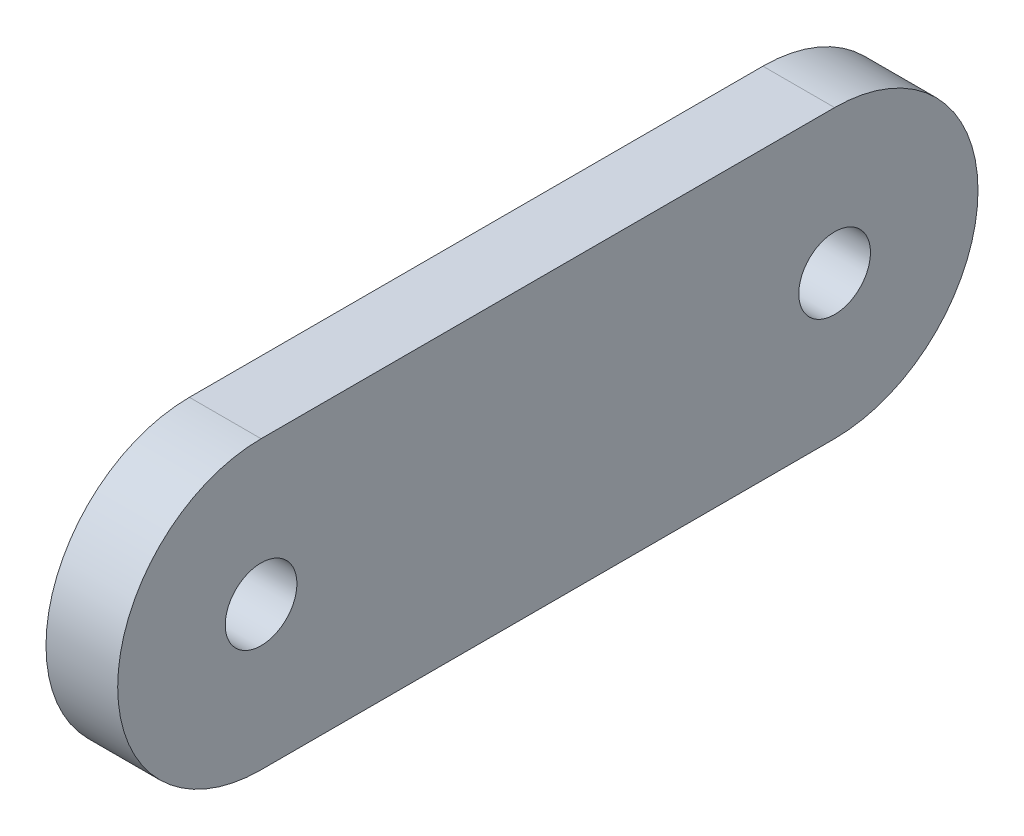
ISO-10303-21;
HEADER;
FILE_DESCRIPTION(('STEP AP214'),'2;1');
FILE_NAME('part.step','',(''),(''),'','','');
FILE_SCHEMA(('AUTOMOTIVE_DESIGN { 1 0 10303 214 1 1 1 1 }'));
ENDSEC;
DATA;
#1=APPLICATION_CONTEXT('core data for automotive mechanical design processes');
#2=APPLICATION_PROTOCOL_DEFINITION('international standard','automotive_design',2000,#1);
#3=PRODUCT_CONTEXT('',#1,'mechanical');
#4=PRODUCT('Part','Part','',(#3));
#5=PRODUCT_RELATED_PRODUCT_CATEGORY('part','',(#4));
#6=PRODUCT_DEFINITION_FORMATION('','',#4);
#7=PRODUCT_DEFINITION_CONTEXT('part definition',#1,'design');
#8=PRODUCT_DEFINITION('design','',#6,#7);
#9=PRODUCT_DEFINITION_SHAPE('','',#8);
#10=(LENGTH_UNIT() NAMED_UNIT(*) SI_UNIT(.MILLI.,.METRE.));
#11=(NAMED_UNIT(*) PLANE_ANGLE_UNIT() SI_UNIT($,.RADIAN.));
#12=(NAMED_UNIT(*) SI_UNIT($,.STERADIAN.) SOLID_ANGLE_UNIT());
#13=UNCERTAINTY_MEASURE_WITH_UNIT(LENGTH_MEASURE(1.E-05),#10,'distance_accuracy_value','');
#14=(GEOMETRIC_REPRESENTATION_CONTEXT(3) GLOBAL_UNCERTAINTY_ASSIGNED_CONTEXT((#13)) GLOBAL_UNIT_ASSIGNED_CONTEXT((#10,
#11,#12)) REPRESENTATION_CONTEXT('',''));
#15=CARTESIAN_POINT('',(0.,0.,0.));
#16=DIRECTION('',(0.,0.,1.));
#17=DIRECTION('',(1.,0.,0.));
#18=AXIS2_PLACEMENT_3D('',#15,#16,#17);
#19=CARTESIAN_POINT('',(5.,0.,0.));
#20=DIRECTION('',(1.,0.,0.));
#21=DIRECTION('',(0.,0.,-1.));
#22=AXIS2_PLACEMENT_3D('',#19,#20,#21);
#23=PLANE('',#22);
#24=CARTESIAN_POINT('',(5.,0.,0.));
#25=DIRECTION('',(1.,0.,0.));
#26=DIRECTION('',(0.,0.,-1.));
#27=AXIS2_PLACEMENT_3D('',#24,#25,#26);
#28=CIRCLE('',#27,2.5);
#29=CARTESIAN_POINT('',(5.,0.,-2.5));
#30=VERTEX_POINT('',#29);
#31=EDGE_CURVE('E100',#30,#30,#28,.T.);
#32=ORIENTED_EDGE('',*,*,#31,.F.);
#33=EDGE_LOOP('',(#32));
#34=FACE_BOUND('',#33,.T.);
#35=CARTESIAN_POINT('',(5.,0.,0.));
#36=DIRECTION('',(1.,0.,0.));
#37=DIRECTION('',(0.,0.,-1.));
#38=AXIS2_PLACEMENT_3D('',#35,#36,#37);
#39=CIRCLE('',#38,10.);
#40=CARTESIAN_POINT('',(5.,10.,0.));
#41=VERTEX_POINT('',#40);
#42=CARTESIAN_POINT('',(5.,-10.,0.));
#43=VERTEX_POINT('',#42);
#44=EDGE_CURVE('E85',#41,#43,#39,.T.);
#45=ORIENTED_EDGE('',*,*,#44,.T.);
#46=DIRECTION('',(0.,0.,-1.));
#47=VECTOR('',#46,1.);
#48=CARTESIAN_POINT('',(5.,-10.,0.));
#49=LINE('',#48,#47);
#50=CARTESIAN_POINT('',(5.,-10.,-40.));
#51=VERTEX_POINT('',#50);
#52=EDGE_CURVE('E80',#43,#51,#49,.T.);
#53=ORIENTED_EDGE('',*,*,#52,.T.);
#54=CARTESIAN_POINT('',(5.,0.,-40.));
#55=DIRECTION('',(1.,0.,0.));
#56=DIRECTION('',(0.,0.,-1.));
#57=AXIS2_PLACEMENT_3D('',#54,#55,#56);
#58=CIRCLE('',#57,10.);
#59=CARTESIAN_POINT('',(5.,10.,-40.));
#60=VERTEX_POINT('',#59);
#61=EDGE_CURVE('E83',#51,#60,#58,.T.);
#62=ORIENTED_EDGE('',*,*,#61,.T.);
#63=DIRECTION('',(0.,0.,1.));
#64=VECTOR('',#63,1.);
#65=CARTESIAN_POINT('',(5.,10.,0.));
#66=LINE('',#65,#64);
#67=EDGE_CURVE('E50',#60,#41,#66,.T.);
#68=ORIENTED_EDGE('',*,*,#67,.T.);
#69=EDGE_LOOP('',(#45,#53,#62,#68));
#70=FACE_BOUND('',#69,.T.);
#71=CARTESIAN_POINT('',(5.,0.,-40.));
#72=DIRECTION('',(1.,0.,0.));
#73=DIRECTION('',(0.,0.,-1.));
#74=AXIS2_PLACEMENT_3D('',#71,#72,#73);
#75=CIRCLE('',#74,2.49999999999999);
#76=CARTESIAN_POINT('',(5.,0.,-42.5));
#77=VERTEX_POINT('',#76);
#78=EDGE_CURVE('E115',#77,#77,#75,.T.);
#79=ORIENTED_EDGE('',*,*,#78,.F.);
#80=EDGE_LOOP('',(#79));
#81=FACE_BOUND('',#80,.T.);
#82=ADVANCED_FACE('F33',(#34,#70,#81),#23,.T.);
#83=CARTESIAN_POINT('',(0.,0.,0.));
#84=DIRECTION('',(1.,0.,0.));
#85=DIRECTION('',(0.,0.,-1.));
#86=AXIS2_PLACEMENT_3D('',#83,#84,#85);
#87=PLANE('',#86);
#88=CARTESIAN_POINT('',(0.,0.,0.));
#89=DIRECTION('',(1.,0.,0.));
#90=DIRECTION('',(0.,0.,-1.));
#91=AXIS2_PLACEMENT_3D('',#88,#89,#90);
#92=CIRCLE('',#91,10.);
#93=CARTESIAN_POINT('',(0.,10.,0.));
#94=VERTEX_POINT('',#93);
#95=CARTESIAN_POINT('',(0.,-10.,0.));
#96=VERTEX_POINT('',#95);
#97=EDGE_CURVE('E97',#94,#96,#92,.T.);
#98=ORIENTED_EDGE('',*,*,#97,.F.);
#99=DIRECTION('',(0.,0.,1.));
#100=VECTOR('',#99,1.);
#101=CARTESIAN_POINT('',(0.,10.,0.));
#102=LINE('',#101,#100);
#103=CARTESIAN_POINT('',(0.,10.,-40.));
#104=VERTEX_POINT('',#103);
#105=EDGE_CURVE('E73',#104,#94,#102,.T.);
#106=ORIENTED_EDGE('',*,*,#105,.F.);
#107=CARTESIAN_POINT('',(0.,0.,-40.));
#108=DIRECTION('',(1.,0.,0.));
#109=DIRECTION('',(0.,0.,-1.));
#110=AXIS2_PLACEMENT_3D('',#107,#108,#109);
#111=CIRCLE('',#110,10.);
#112=CARTESIAN_POINT('',(0.,-10.,-40.));
#113=VERTEX_POINT('',#112);
#114=EDGE_CURVE('E67',#113,#104,#111,.T.);
#115=ORIENTED_EDGE('',*,*,#114,.F.);
#116=DIRECTION('',(0.,0.,-1.));
#117=VECTOR('',#116,1.);
#118=CARTESIAN_POINT('',(0.,-10.,0.));
#119=LINE('',#118,#117);
#120=EDGE_CURVE('E89',#96,#113,#119,.T.);
#121=ORIENTED_EDGE('',*,*,#120,.F.);
#122=EDGE_LOOP('',(#98,#106,#115,#121));
#123=FACE_BOUND('',#122,.T.);
#124=CARTESIAN_POINT('',(0.,0.,0.));
#125=DIRECTION('',(1.,0.,0.));
#126=DIRECTION('',(0.,0.,-1.));
#127=AXIS2_PLACEMENT_3D('',#124,#125,#126);
#128=CIRCLE('',#127,2.5);
#129=CARTESIAN_POINT('',(0.,0.,-2.5));
#130=VERTEX_POINT('',#129);
#131=EDGE_CURVE('E112',#130,#130,#128,.T.);
#132=ORIENTED_EDGE('',*,*,#131,.T.);
#133=EDGE_LOOP('',(#132));
#134=FACE_BOUND('',#133,.T.);
#135=CARTESIAN_POINT('',(0.,0.,-40.));
#136=DIRECTION('',(1.,0.,0.));
#137=DIRECTION('',(0.,0.,-1.));
#138=AXIS2_PLACEMENT_3D('',#135,#136,#137);
#139=CIRCLE('',#138,2.49999999999999);
#140=CARTESIAN_POINT('',(0.,0.,-42.5));
#141=VERTEX_POINT('',#140);
#142=EDGE_CURVE('E118',#141,#141,#139,.T.);
#143=ORIENTED_EDGE('',*,*,#142,.T.);
#144=EDGE_LOOP('',(#143));
#145=FACE_BOUND('',#144,.T.);
#146=ADVANCED_FACE('F108',(#123,#134,#145),#87,.F.);
#147=CARTESIAN_POINT('',(5.,0.,0.));
#148=DIRECTION('',(-1.,0.,0.));
#149=DIRECTION('',(0.,0.,1.));
#150=AXIS2_PLACEMENT_3D('',#147,#148,#149);
#151=CYLINDRICAL_SURFACE('',#150,10.);
#152=ORIENTED_EDGE('',*,*,#97,.T.);
#153=DIRECTION('',(-1.,0.,0.));
#154=VECTOR('',#153,1.);
#155=CARTESIAN_POINT('',(5.,-10.,0.));
#156=LINE('',#155,#154);
#157=EDGE_CURVE('E11',#43,#96,#156,.T.);
#158=ORIENTED_EDGE('',*,*,#157,.F.);
#159=ORIENTED_EDGE('',*,*,#44,.F.);
#160=DIRECTION('',(-1.,0.,0.));
#161=VECTOR('',#160,1.);
#162=CARTESIAN_POINT('',(5.,10.,0.));
#163=LINE('',#162,#161);
#164=EDGE_CURVE('E93',#41,#94,#163,.T.);
#165=ORIENTED_EDGE('',*,*,#164,.T.);
#166=EDGE_LOOP('',(#152,#158,#159,#165));
#167=FACE_BOUND('',#166,.T.);
#168=ADVANCED_FACE('F35',(#167),#151,.T.);
#169=CARTESIAN_POINT('',(5.,-10.,0.));
#170=DIRECTION('',(0.,1.,0.));
#171=DIRECTION('',(0.,0.,1.));
#172=AXIS2_PLACEMENT_3D('',#169,#170,#171);
#173=PLANE('',#172);
#174=ORIENTED_EDGE('',*,*,#120,.T.);
#175=DIRECTION('',(-1.,0.,0.));
#176=VECTOR('',#175,1.);
#177=CARTESIAN_POINT('',(5.,-10.,-40.));
#178=LINE('',#177,#176);
#179=EDGE_CURVE('E42',#51,#113,#178,.T.);
#180=ORIENTED_EDGE('',*,*,#179,.F.);
#181=ORIENTED_EDGE('',*,*,#52,.F.);
#182=ORIENTED_EDGE('',*,*,#157,.T.);
#183=EDGE_LOOP('',(#174,#180,#181,#182));
#184=FACE_BOUND('',#183,.T.);
#185=ADVANCED_FACE('F88',(#184),#173,.F.);
#186=CARTESIAN_POINT('',(5.,0.,-40.));
#187=DIRECTION('',(-1.,0.,0.));
#188=DIRECTION('',(0.,0.,1.));
#189=AXIS2_PLACEMENT_3D('',#186,#187,#188);
#190=CYLINDRICAL_SURFACE('',#189,10.);
#191=ORIENTED_EDGE('',*,*,#114,.T.);
#192=DIRECTION('',(-1.,0.,0.));
#193=VECTOR('',#192,1.);
#194=CARTESIAN_POINT('',(5.,10.,-40.));
#195=LINE('',#194,#193);
#196=EDGE_CURVE('E90',#60,#104,#195,.T.);
#197=ORIENTED_EDGE('',*,*,#196,.F.);
#198=ORIENTED_EDGE('',*,*,#61,.F.);
#199=ORIENTED_EDGE('',*,*,#179,.T.);
#200=EDGE_LOOP('',(#191,#197,#198,#199));
#201=FACE_BOUND('',#200,.T.);
#202=ADVANCED_FACE('F91',(#201),#190,.T.);
#203=CARTESIAN_POINT('',(5.,10.,0.));
#204=DIRECTION('',(0.,-1.,0.));
#205=DIRECTION('',(0.,0.,-1.));
#206=AXIS2_PLACEMENT_3D('',#203,#204,#205);
#207=PLANE('',#206);
#208=ORIENTED_EDGE('',*,*,#105,.T.);
#209=ORIENTED_EDGE('',*,*,#164,.F.);
#210=ORIENTED_EDGE('',*,*,#67,.F.);
#211=ORIENTED_EDGE('',*,*,#196,.T.);
#212=EDGE_LOOP('',(#208,#209,#210,#211));
#213=FACE_BOUND('',#212,.T.);
#214=ADVANCED_FACE('F105',(#213),#207,.F.);
#215=CARTESIAN_POINT('',(5.,0.,0.));
#216=DIRECTION('',(-1.,0.,0.));
#217=DIRECTION('',(0.,0.,1.));
#218=AXIS2_PLACEMENT_3D('',#215,#216,#217);
#219=CYLINDRICAL_SURFACE('',#218,2.5);
#220=ORIENTED_EDGE('',*,*,#31,.T.);
#221=EDGE_LOOP('',(#220));
#222=FACE_BOUND('',#221,.T.);
#223=ORIENTED_EDGE('',*,*,#131,.F.);
#224=EDGE_LOOP('',(#223));
#225=FACE_BOUND('',#224,.T.);
#226=ADVANCED_FACE('F135',(#222,#225),#219,.F.);
#227=CARTESIAN_POINT('',(5.,0.,-40.));
#228=DIRECTION('',(-1.,0.,0.));
#229=DIRECTION('',(0.,0.,1.));
#230=AXIS2_PLACEMENT_3D('',#227,#228,#229);
#231=CYLINDRICAL_SURFACE('',#230,2.49999999999999);
#232=ORIENTED_EDGE('',*,*,#78,.T.);
#233=EDGE_LOOP('',(#232));
#234=FACE_BOUND('',#233,.T.);
#235=ORIENTED_EDGE('',*,*,#142,.F.);
#236=EDGE_LOOP('',(#235));
#237=FACE_BOUND('',#236,.T.);
#238=ADVANCED_FACE('F124',(#234,#237),#231,.F.);
#239=CLOSED_SHELL('',(#82,#146,#168,#185,#202,#214,#226,#238));
#240=MANIFOLD_SOLID_BREP('B2',#239);
#241=ADVANCED_BREP_SHAPE_REPRESENTATION('',(#18,#240),#14);
#242=SHAPE_DEFINITION_REPRESENTATION(#9,#241);
ENDSEC;
END-ISO-10303-21;
